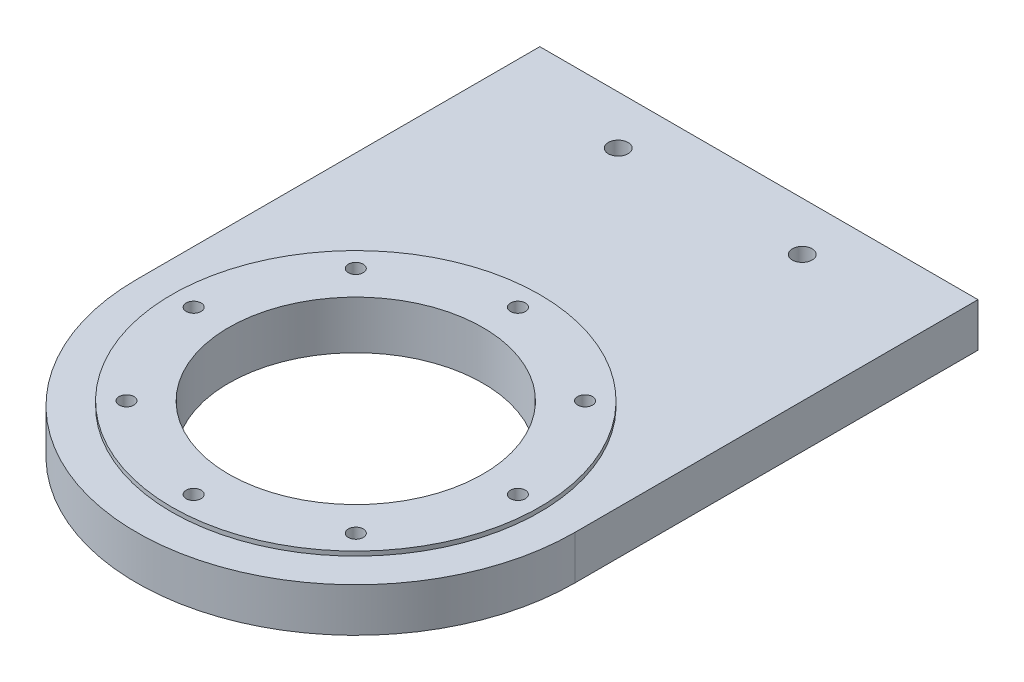
ISO-10303-21;
HEADER;
FILE_DESCRIPTION(('STEP AP214'),'2;1');
FILE_NAME('part.step','',(''),(''),'','','');
FILE_SCHEMA(('AUTOMOTIVE_DESIGN { 1 0 10303 214 1 1 1 1 }'));
ENDSEC;
DATA;
#1=APPLICATION_CONTEXT('core data for automotive mechanical design processes');
#2=APPLICATION_PROTOCOL_DEFINITION('international standard','automotive_design',2000,#1);
#3=PRODUCT_CONTEXT('',#1,'mechanical');
#4=PRODUCT('Part','Part','',(#3));
#5=PRODUCT_RELATED_PRODUCT_CATEGORY('part','',(#4));
#6=PRODUCT_DEFINITION_FORMATION('','',#4);
#7=PRODUCT_DEFINITION_CONTEXT('part definition',#1,'design');
#8=PRODUCT_DEFINITION('design','',#6,#7);
#9=PRODUCT_DEFINITION_SHAPE('','',#8);
#10=(LENGTH_UNIT() NAMED_UNIT(*) SI_UNIT(.MILLI.,.METRE.));
#11=(NAMED_UNIT(*) PLANE_ANGLE_UNIT() SI_UNIT($,.RADIAN.));
#12=(NAMED_UNIT(*) SI_UNIT($,.STERADIAN.) SOLID_ANGLE_UNIT());
#13=UNCERTAINTY_MEASURE_WITH_UNIT(LENGTH_MEASURE(1.E-05),#10,'distance_accuracy_value','');
#14=(GEOMETRIC_REPRESENTATION_CONTEXT(3) GLOBAL_UNCERTAINTY_ASSIGNED_CONTEXT((#13)) GLOBAL_UNIT_ASSIGNED_CONTEXT((#10,
#11,#12)) REPRESENTATION_CONTEXT('',''));
#15=CARTESIAN_POINT('',(0.,0.,0.));
#16=DIRECTION('',(0.,0.,1.));
#17=DIRECTION('',(1.,0.,0.));
#18=AXIS2_PLACEMENT_3D('',#15,#16,#17);
#19=CARTESIAN_POINT('',(50.,-29.75,170.));
#20=DIRECTION('',(-1.,0.,0.));
#21=DIRECTION('',(0.,0.,1.));
#22=AXIS2_PLACEMENT_3D('',#19,#20,#21);
#23=PLANE('',#22);
#24=DIRECTION('',(0.,0.,-1.));
#25=VECTOR('',#24,1.);
#26=CARTESIAN_POINT('',(50.,-39.75,170.));
#27=LINE('',#26,#25);
#28=CARTESIAN_POINT('',(50.,-39.75,170.));
#29=VERTEX_POINT('',#28);
#30=CARTESIAN_POINT('',(50.,-39.75,78.));
#31=VERTEX_POINT('',#30);
#32=EDGE_CURVE('E112',#29,#31,#27,.T.);
#33=ORIENTED_EDGE('',*,*,#32,.T.);
#34=DIRECTION('',(0.,-1.,0.));
#35=VECTOR('',#34,1.);
#36=CARTESIAN_POINT('',(50.,-29.75,78.));
#37=LINE('',#36,#35);
#38=CARTESIAN_POINT('',(50.,-29.75,78.));
#39=VERTEX_POINT('',#38);
#40=EDGE_CURVE('E46',#39,#31,#37,.T.);
#41=ORIENTED_EDGE('',*,*,#40,.F.);
#42=DIRECTION('',(0.,0.,-1.));
#43=VECTOR('',#42,1.);
#44=CARTESIAN_POINT('',(50.,-29.75,170.));
#45=LINE('',#44,#43);
#46=CARTESIAN_POINT('',(50.,-29.75,170.));
#47=VERTEX_POINT('',#46);
#48=EDGE_CURVE('E62',#47,#39,#45,.T.);
#49=ORIENTED_EDGE('',*,*,#48,.F.);
#50=DIRECTION('',(0.,-1.,0.));
#51=VECTOR('',#50,1.);
#52=CARTESIAN_POINT('',(50.,-29.75,170.));
#53=LINE('',#52,#51);
#54=EDGE_CURVE('E78',#47,#29,#53,.T.);
#55=ORIENTED_EDGE('',*,*,#54,.T.);
#56=EDGE_LOOP('',(#33,#41,#49,#55));
#57=FACE_BOUND('',#56,.T.);
#58=ADVANCED_FACE('F43',(#57),#23,.F.);
#59=CARTESIAN_POINT('',(-50.,-29.75,78.));
#60=DIRECTION('',(0.,0.,1.));
#61=DIRECTION('',(1.,0.,0.));
#62=AXIS2_PLACEMENT_3D('',#59,#60,#61);
#63=PLANE('',#62);
#64=DIRECTION('',(-1.,0.,0.));
#65=VECTOR('',#64,1.);
#66=CARTESIAN_POINT('',(-50.,-39.75,78.));
#67=LINE('',#66,#65);
#68=CARTESIAN_POINT('',(-50.,-39.75,78.));
#69=VERTEX_POINT('',#68);
#70=EDGE_CURVE('E77',#31,#69,#67,.T.);
#71=ORIENTED_EDGE('',*,*,#70,.T.);
#72=DIRECTION('',(0.,-1.,0.));
#73=VECTOR('',#72,1.);
#74=CARTESIAN_POINT('',(-50.,-29.75,78.));
#75=LINE('',#74,#73);
#76=CARTESIAN_POINT('',(-50.,-29.75,78.));
#77=VERTEX_POINT('',#76);
#78=EDGE_CURVE('E100',#77,#69,#75,.T.);
#79=ORIENTED_EDGE('',*,*,#78,.F.);
#80=DIRECTION('',(-1.,0.,0.));
#81=VECTOR('',#80,1.);
#82=CARTESIAN_POINT('',(-50.,-29.75,78.));
#83=LINE('',#82,#81);
#84=EDGE_CURVE('E84',#39,#77,#83,.T.);
#85=ORIENTED_EDGE('',*,*,#84,.F.);
#86=ORIENTED_EDGE('',*,*,#40,.T.);
#87=EDGE_LOOP('',(#71,#79,#85,#86));
#88=FACE_BOUND('',#87,.T.);
#89=ADVANCED_FACE('F139',(#88),#63,.F.);
#90=CARTESIAN_POINT('',(-50.,-29.75,170.));
#91=DIRECTION('',(1.,0.,0.));
#92=DIRECTION('',(0.,0.,-1.));
#93=AXIS2_PLACEMENT_3D('',#90,#91,#92);
#94=PLANE('',#93);
#95=DIRECTION('',(0.,0.,1.));
#96=VECTOR('',#95,1.);
#97=CARTESIAN_POINT('',(-50.,-39.75,170.));
#98=LINE('',#97,#96);
#99=CARTESIAN_POINT('',(-50.,-39.75,170.));
#100=VERTEX_POINT('',#99);
#101=EDGE_CURVE('E93',#69,#100,#98,.T.);
#102=ORIENTED_EDGE('',*,*,#101,.T.);
#103=DIRECTION('',(0.,-1.,0.));
#104=VECTOR('',#103,1.);
#105=CARTESIAN_POINT('',(-50.,-29.75,170.));
#106=LINE('',#105,#104);
#107=CARTESIAN_POINT('',(-50.,-29.75,170.));
#108=VERTEX_POINT('',#107);
#109=EDGE_CURVE('E92',#108,#100,#106,.T.);
#110=ORIENTED_EDGE('',*,*,#109,.F.);
#111=DIRECTION('',(0.,0.,1.));
#112=VECTOR('',#111,1.);
#113=CARTESIAN_POINT('',(-50.,-29.75,170.));
#114=LINE('',#113,#112);
#115=EDGE_CURVE('E127',#77,#108,#114,.T.);
#116=ORIENTED_EDGE('',*,*,#115,.F.);
#117=ORIENTED_EDGE('',*,*,#78,.T.);
#118=EDGE_LOOP('',(#102,#110,#116,#117));
#119=FACE_BOUND('',#118,.T.);
#120=ADVANCED_FACE('F91',(#119),#94,.F.);
#121=CARTESIAN_POINT('',(0.,-29.75,0.));
#122=DIRECTION('',(0.,-1.,0.));
#123=DIRECTION('',(0.,0.,-1.));
#124=AXIS2_PLACEMENT_3D('',#121,#122,#123);
#125=PLANE('',#124);
#126=CARTESIAN_POINT('',(-21.,-29.75,89.11));
#127=DIRECTION('',(0.,1.,0.));
#128=DIRECTION('',(0.,0.,1.));
#129=AXIS2_PLACEMENT_3D('',#126,#127,#128);
#130=CIRCLE('',#129,2.25);
#131=CARTESIAN_POINT('',(-21.,-29.75,91.36));
#132=VERTEX_POINT('',#131);
#133=EDGE_CURVE('E215',#132,#132,#130,.T.);
#134=ORIENTED_EDGE('',*,*,#133,.F.);
#135=EDGE_LOOP('',(#134));
#136=FACE_BOUND('',#135,.T.);
#137=CARTESIAN_POINT('',(21.,-29.75,89.11));
#138=DIRECTION('',(0.,1.,0.));
#139=DIRECTION('',(0.,0.,1.));
#140=AXIS2_PLACEMENT_3D('',#137,#138,#139);
#141=CIRCLE('',#140,2.25);
#142=CARTESIAN_POINT('',(21.,-29.75,91.36));
#143=VERTEX_POINT('',#142);
#144=EDGE_CURVE('E223',#143,#143,#141,.T.);
#145=ORIENTED_EDGE('',*,*,#144,.F.);
#146=EDGE_LOOP('',(#145));
#147=FACE_BOUND('',#146,.T.);
#148=CARTESIAN_POINT('',(0.,-29.75,170.));
#149=DIRECTION('',(0.,1.,0.));
#150=DIRECTION('',(0.,0.,1.));
#151=AXIS2_PLACEMENT_3D('',#148,#149,#150);
#152=CIRCLE('',#151,42.);
#153=CARTESIAN_POINT('',(0.,-29.75,212.));
#154=VERTEX_POINT('',#153);
#155=EDGE_CURVE('E11',#154,#154,#152,.T.);
#156=ORIENTED_EDGE('',*,*,#155,.F.);
#157=EDGE_LOOP('',(#156));
#158=FACE_BOUND('',#157,.T.);
#159=ORIENTED_EDGE('',*,*,#115,.T.);
#160=CARTESIAN_POINT('',(0.,-29.75,170.));
#161=DIRECTION('',(0.,1.,0.));
#162=DIRECTION('',(0.,0.,1.));
#163=AXIS2_PLACEMENT_3D('',#160,#161,#162);
#164=CIRCLE('',#163,50.);
#165=EDGE_CURVE('E110',#108,#47,#164,.T.);
#166=ORIENTED_EDGE('',*,*,#165,.T.);
#167=ORIENTED_EDGE('',*,*,#48,.T.);
#168=ORIENTED_EDGE('',*,*,#84,.T.);
#169=EDGE_LOOP('',(#159,#166,#167,#168));
#170=FACE_BOUND('',#169,.T.);
#171=ADVANCED_FACE('F148',(#136,#147,#158,#170),#125,.F.);
#172=CARTESIAN_POINT('',(0.,-39.75,0.));
#173=DIRECTION('',(0.,-1.,0.));
#174=DIRECTION('',(0.,0.,-1.));
#175=AXIS2_PLACEMENT_3D('',#172,#173,#174);
#176=PLANE('',#175);
#177=CARTESIAN_POINT('',(-21.,-39.75,89.11));
#178=DIRECTION('',(0.,1.,0.));
#179=DIRECTION('',(0.,0.,1.));
#180=AXIS2_PLACEMENT_3D('',#177,#178,#179);
#181=CIRCLE('',#180,2.25);
#182=CARTESIAN_POINT('',(-21.,-39.75,91.36));
#183=VERTEX_POINT('',#182);
#184=EDGE_CURVE('E214',#183,#183,#181,.T.);
#185=ORIENTED_EDGE('',*,*,#184,.T.);
#186=EDGE_LOOP('',(#185));
#187=FACE_BOUND('',#186,.T.);
#188=CARTESIAN_POINT('',(21.,-39.75,89.11));
#189=DIRECTION('',(0.,1.,0.));
#190=DIRECTION('',(0.,0.,1.));
#191=AXIS2_PLACEMENT_3D('',#188,#189,#190);
#192=CIRCLE('',#191,2.25);
#193=CARTESIAN_POINT('',(21.,-39.75,91.36));
#194=VERTEX_POINT('',#193);
#195=EDGE_CURVE('E220',#194,#194,#192,.T.);
#196=ORIENTED_EDGE('',*,*,#195,.T.);
#197=EDGE_LOOP('',(#196));
#198=FACE_BOUND('',#197,.T.);
#199=CARTESIAN_POINT('',(37.,-39.75,170.));
#200=DIRECTION('',(0.,1.,0.));
#201=DIRECTION('',(0.,0.,1.));
#202=AXIS2_PLACEMENT_3D('',#199,#200,#201);
#203=CIRCLE('',#202,1.7);
#204=CARTESIAN_POINT('',(37.,-39.75,171.7));
#205=VERTEX_POINT('',#204);
#206=EDGE_CURVE('E237',#205,#205,#203,.T.);
#207=ORIENTED_EDGE('',*,*,#206,.T.);
#208=EDGE_LOOP('',(#207));
#209=FACE_BOUND('',#208,.T.);
#210=CARTESIAN_POINT('',(26.1629509039023,-39.75,196.162950903902));
#211=DIRECTION('',(0.,1.,0.));
#212=DIRECTION('',(0.,0.,1.));
#213=AXIS2_PLACEMENT_3D('',#210,#211,#212);
#214=CIRCLE('',#213,1.7);
#215=CARTESIAN_POINT('',(26.1629509039023,-39.75,197.862950903902));
#216=VERTEX_POINT('',#215);
#217=EDGE_CURVE('E238',#216,#216,#214,.T.);
#218=ORIENTED_EDGE('',*,*,#217,.T.);
#219=EDGE_LOOP('',(#218));
#220=FACE_BOUND('',#219,.T.);
#221=CARTESIAN_POINT('',(0.,-39.75,207.));
#222=DIRECTION('',(0.,1.,0.));
#223=DIRECTION('',(0.,0.,1.));
#224=AXIS2_PLACEMENT_3D('',#221,#222,#223);
#225=CIRCLE('',#224,1.7);
#226=CARTESIAN_POINT('',(0.,-39.75,208.7));
#227=VERTEX_POINT('',#226);
#228=EDGE_CURVE('E246',#227,#227,#225,.T.);
#229=ORIENTED_EDGE('',*,*,#228,.T.);
#230=EDGE_LOOP('',(#229));
#231=FACE_BOUND('',#230,.T.);
#232=CARTESIAN_POINT('',(-26.1629509039023,-39.75,196.162950903902));
#233=DIRECTION('',(0.,1.,0.));
#234=DIRECTION('',(0.,0.,1.));
#235=AXIS2_PLACEMENT_3D('',#232,#233,#234);
#236=CIRCLE('',#235,1.7);
#237=CARTESIAN_POINT('',(-26.1629509039023,-39.75,197.862950903902));
#238=VERTEX_POINT('',#237);
#239=EDGE_CURVE('E254',#238,#238,#236,.T.);
#240=ORIENTED_EDGE('',*,*,#239,.T.);
#241=EDGE_LOOP('',(#240));
#242=FACE_BOUND('',#241,.T.);
#243=CARTESIAN_POINT('',(-37.,-39.75,170.));
#244=DIRECTION('',(0.,1.,0.));
#245=DIRECTION('',(0.,0.,1.));
#246=AXIS2_PLACEMENT_3D('',#243,#244,#245);
#247=CIRCLE('',#246,1.7);
#248=CARTESIAN_POINT('',(-37.,-39.75,171.7));
#249=VERTEX_POINT('',#248);
#250=EDGE_CURVE('E265',#249,#249,#247,.T.);
#251=ORIENTED_EDGE('',*,*,#250,.T.);
#252=EDGE_LOOP('',(#251));
#253=FACE_BOUND('',#252,.T.);
#254=CARTESIAN_POINT('',(-26.1629509039023,-39.75,143.837049096098));
#255=DIRECTION('',(0.,1.,0.));
#256=DIRECTION('',(0.,0.,1.));
#257=AXIS2_PLACEMENT_3D('',#254,#255,#256);
#258=CIRCLE('',#257,1.7);
#259=CARTESIAN_POINT('',(-26.1629509039023,-39.75,145.537049096098));
#260=VERTEX_POINT('',#259);
#261=EDGE_CURVE('E268',#260,#260,#258,.T.);
#262=ORIENTED_EDGE('',*,*,#261,.T.);
#263=EDGE_LOOP('',(#262));
#264=FACE_BOUND('',#263,.T.);
#265=CARTESIAN_POINT('',(0.,-39.75,133.));
#266=DIRECTION('',(0.,1.,0.));
#267=DIRECTION('',(0.,0.,1.));
#268=AXIS2_PLACEMENT_3D('',#265,#266,#267);
#269=CIRCLE('',#268,1.7);
#270=CARTESIAN_POINT('',(0.,-39.75,134.7));
#271=VERTEX_POINT('',#270);
#272=EDGE_CURVE('E277',#271,#271,#269,.T.);
#273=ORIENTED_EDGE('',*,*,#272,.T.);
#274=EDGE_LOOP('',(#273));
#275=FACE_BOUND('',#274,.T.);
#276=CARTESIAN_POINT('',(26.1629509039023,-39.75,143.837049096098));
#277=DIRECTION('',(0.,1.,0.));
#278=DIRECTION('',(0.,0.,1.));
#279=AXIS2_PLACEMENT_3D('',#276,#277,#278);
#280=CIRCLE('',#279,1.7);
#281=CARTESIAN_POINT('',(26.1629509039023,-39.75,145.537049096098));
#282=VERTEX_POINT('',#281);
#283=EDGE_CURVE('E285',#282,#282,#280,.T.);
#284=ORIENTED_EDGE('',*,*,#283,.T.);
#285=EDGE_LOOP('',(#284));
#286=FACE_BOUND('',#285,.T.);
#287=CARTESIAN_POINT('',(0.,-39.75,170.));
#288=DIRECTION('',(0.,1.,0.));
#289=DIRECTION('',(0.,0.,1.));
#290=AXIS2_PLACEMENT_3D('',#287,#288,#289);
#291=CIRCLE('',#290,29.);
#292=CARTESIAN_POINT('',(0.,-39.75,199.));
#293=VERTEX_POINT('',#292);
#294=EDGE_CURVE('E234',#293,#293,#291,.T.);
#295=ORIENTED_EDGE('',*,*,#294,.T.);
#296=EDGE_LOOP('',(#295));
#297=FACE_BOUND('',#296,.T.);
#298=ORIENTED_EDGE('',*,*,#32,.F.);
#299=CARTESIAN_POINT('',(0.,-39.75,170.));
#300=DIRECTION('',(0.,1.,0.));
#301=DIRECTION('',(0.,0.,1.));
#302=AXIS2_PLACEMENT_3D('',#299,#300,#301);
#303=CIRCLE('',#302,50.);
#304=EDGE_CURVE('E104',#100,#29,#303,.T.);
#305=ORIENTED_EDGE('',*,*,#304,.F.);
#306=ORIENTED_EDGE('',*,*,#101,.F.);
#307=ORIENTED_EDGE('',*,*,#70,.F.);
#308=EDGE_LOOP('',(#298,#305,#306,#307));
#309=FACE_BOUND('',#308,.T.);
#310=ADVANCED_FACE('F109',(#187,#198,#209,#220,#231,#242,#253,#264,#275,#286,#297,#309),#176,.T.);
#311=CARTESIAN_POINT('',(0.,-29.75,170.));
#312=DIRECTION('',(0.,-1.,0.));
#313=DIRECTION('',(0.,0.,-1.));
#314=AXIS2_PLACEMENT_3D('',#311,#312,#313);
#315=CYLINDRICAL_SURFACE('',#314,50.);
#316=ORIENTED_EDGE('',*,*,#304,.T.);
#317=ORIENTED_EDGE('',*,*,#54,.F.);
#318=ORIENTED_EDGE('',*,*,#165,.F.);
#319=ORIENTED_EDGE('',*,*,#109,.T.);
#320=EDGE_LOOP('',(#316,#317,#318,#319));
#321=FACE_BOUND('',#320,.T.);
#322=ADVANCED_FACE('F102',(#321),#315,.T.);
#323=CARTESIAN_POINT('',(0.,-28.75,170.));
#324=DIRECTION('',(0.,1.,0.));
#325=DIRECTION('',(0.,0.,1.));
#326=AXIS2_PLACEMENT_3D('',#323,#324,#325);
#327=PLANE('',#326);
#328=CARTESIAN_POINT('',(37.,-28.75,170.));
#329=DIRECTION('',(0.,1.,0.));
#330=DIRECTION('',(0.,0.,1.));
#331=AXIS2_PLACEMENT_3D('',#328,#329,#330);
#332=CIRCLE('',#331,1.7);
#333=CARTESIAN_POINT('',(37.,-28.75,171.7));
#334=VERTEX_POINT('',#333);
#335=EDGE_CURVE('E233',#334,#334,#332,.T.);
#336=ORIENTED_EDGE('',*,*,#335,.F.);
#337=EDGE_LOOP('',(#336));
#338=FACE_BOUND('',#337,.T.);
#339=CARTESIAN_POINT('',(26.1629509039023,-28.75,196.162950903902));
#340=DIRECTION('',(0.,1.,0.));
#341=DIRECTION('',(0.,0.,1.));
#342=AXIS2_PLACEMENT_3D('',#339,#340,#341);
#343=CIRCLE('',#342,1.7);
#344=CARTESIAN_POINT('',(26.1629509039023,-28.75,197.862950903902));
#345=VERTEX_POINT('',#344);
#346=EDGE_CURVE('E241',#345,#345,#343,.T.);
#347=ORIENTED_EDGE('',*,*,#346,.F.);
#348=EDGE_LOOP('',(#347));
#349=FACE_BOUND('',#348,.T.);
#350=CARTESIAN_POINT('',(0.,-28.75,207.));
#351=DIRECTION('',(0.,1.,0.));
#352=DIRECTION('',(0.,0.,1.));
#353=AXIS2_PLACEMENT_3D('',#350,#351,#352);
#354=CIRCLE('',#353,1.7);
#355=CARTESIAN_POINT('',(0.,-28.75,208.7));
#356=VERTEX_POINT('',#355);
#357=EDGE_CURVE('E253',#356,#356,#354,.T.);
#358=ORIENTED_EDGE('',*,*,#357,.F.);
#359=EDGE_LOOP('',(#358));
#360=FACE_BOUND('',#359,.T.);
#361=CARTESIAN_POINT('',(-26.1629509039023,-28.75,196.162950903902));
#362=DIRECTION('',(0.,1.,0.));
#363=DIRECTION('',(0.,0.,1.));
#364=AXIS2_PLACEMENT_3D('',#361,#362,#363);
#365=CIRCLE('',#364,1.7);
#366=CARTESIAN_POINT('',(-26.1629509039023,-28.75,197.862950903902));
#367=VERTEX_POINT('',#366);
#368=EDGE_CURVE('E256',#367,#367,#365,.T.);
#369=ORIENTED_EDGE('',*,*,#368,.F.);
#370=EDGE_LOOP('',(#369));
#371=FACE_BOUND('',#370,.T.);
#372=CARTESIAN_POINT('',(-37.,-28.75,170.));
#373=DIRECTION('',(0.,1.,0.));
#374=DIRECTION('',(0.,0.,1.));
#375=AXIS2_PLACEMENT_3D('',#372,#373,#374);
#376=CIRCLE('',#375,1.7);
#377=CARTESIAN_POINT('',(-37.,-28.75,171.7));
#378=VERTEX_POINT('',#377);
#379=EDGE_CURVE('E264',#378,#378,#376,.T.);
#380=ORIENTED_EDGE('',*,*,#379,.F.);
#381=EDGE_LOOP('',(#380));
#382=FACE_BOUND('',#381,.T.);
#383=CARTESIAN_POINT('',(-26.1629509039023,-28.75,143.837049096098));
#384=DIRECTION('',(0.,1.,0.));
#385=DIRECTION('',(0.,0.,1.));
#386=AXIS2_PLACEMENT_3D('',#383,#384,#385);
#387=CIRCLE('',#386,1.7);
#388=CARTESIAN_POINT('',(-26.1629509039023,-28.75,145.537049096098));
#389=VERTEX_POINT('',#388);
#390=EDGE_CURVE('E275',#389,#389,#387,.T.);
#391=ORIENTED_EDGE('',*,*,#390,.F.);
#392=EDGE_LOOP('',(#391));
#393=FACE_BOUND('',#392,.T.);
#394=CARTESIAN_POINT('',(0.,-28.75,133.));
#395=DIRECTION('',(0.,1.,0.));
#396=DIRECTION('',(0.,0.,1.));
#397=AXIS2_PLACEMENT_3D('',#394,#395,#396);
#398=CIRCLE('',#397,1.7);
#399=CARTESIAN_POINT('',(0.,-28.75,134.7));
#400=VERTEX_POINT('',#399);
#401=EDGE_CURVE('E278',#400,#400,#398,.T.);
#402=ORIENTED_EDGE('',*,*,#401,.F.);
#403=EDGE_LOOP('',(#402));
#404=FACE_BOUND('',#403,.T.);
#405=CARTESIAN_POINT('',(26.1629509039023,-28.75,143.837049096098));
#406=DIRECTION('',(0.,1.,0.));
#407=DIRECTION('',(0.,0.,1.));
#408=AXIS2_PLACEMENT_3D('',#405,#406,#407);
#409=CIRCLE('',#408,1.7);
#410=CARTESIAN_POINT('',(26.1629509039023,-28.75,145.537049096098));
#411=VERTEX_POINT('',#410);
#412=EDGE_CURVE('E222',#411,#411,#409,.T.);
#413=ORIENTED_EDGE('',*,*,#412,.F.);
#414=EDGE_LOOP('',(#413));
#415=FACE_BOUND('',#414,.T.);
#416=CARTESIAN_POINT('',(0.,-28.75,170.));
#417=DIRECTION('',(0.,1.,0.));
#418=DIRECTION('',(0.,0.,1.));
#419=AXIS2_PLACEMENT_3D('',#416,#417,#418);
#420=CIRCLE('',#419,42.);
#421=CARTESIAN_POINT('',(0.,-28.75,212.));
#422=VERTEX_POINT('',#421);
#423=EDGE_CURVE('E114',#422,#422,#420,.T.);
#424=ORIENTED_EDGE('',*,*,#423,.T.);
#425=EDGE_LOOP('',(#424));
#426=FACE_BOUND('',#425,.T.);
#427=CARTESIAN_POINT('',(0.,-28.75,170.));
#428=DIRECTION('',(0.,1.,0.));
#429=DIRECTION('',(0.,0.,1.));
#430=AXIS2_PLACEMENT_3D('',#427,#428,#429);
#431=CIRCLE('',#430,29.);
#432=CARTESIAN_POINT('',(0.,-28.75,199.));
#433=VERTEX_POINT('',#432);
#434=EDGE_CURVE('E116',#433,#433,#431,.T.);
#435=ORIENTED_EDGE('',*,*,#434,.F.);
#436=EDGE_LOOP('',(#435));
#437=FACE_BOUND('',#436,.T.);
#438=ADVANCED_FACE('F160',(#338,#349,#360,#371,#382,#393,#404,#415,#426,#437),#327,.T.);
#439=CARTESIAN_POINT('',(0.,-28.75,170.));
#440=DIRECTION('',(0.,-1.,0.));
#441=DIRECTION('',(0.,0.,-1.));
#442=AXIS2_PLACEMENT_3D('',#439,#440,#441);
#443=CYLINDRICAL_SURFACE('',#442,42.);
#444=ORIENTED_EDGE('',*,*,#423,.F.);
#445=EDGE_LOOP('',(#444));
#446=FACE_BOUND('',#445,.T.);
#447=ORIENTED_EDGE('',*,*,#155,.T.);
#448=EDGE_LOOP('',(#447));
#449=FACE_BOUND('',#448,.T.);
#450=ADVANCED_FACE('F158',(#446,#449),#443,.T.);
#451=CARTESIAN_POINT('',(0.,-28.75,170.));
#452=DIRECTION('',(0.,-1.,0.));
#453=DIRECTION('',(0.,0.,-1.));
#454=AXIS2_PLACEMENT_3D('',#451,#452,#453);
#455=CYLINDRICAL_SURFACE('',#454,29.);
#456=ORIENTED_EDGE('',*,*,#434,.T.);
#457=EDGE_LOOP('',(#456));
#458=FACE_BOUND('',#457,.T.);
#459=ORIENTED_EDGE('',*,*,#294,.F.);
#460=EDGE_LOOP('',(#459));
#461=FACE_BOUND('',#460,.T.);
#462=ADVANCED_FACE('F161',(#458,#461),#455,.F.);
#463=CARTESIAN_POINT('',(26.1629509039023,-28.75,143.837049096098));
#464=DIRECTION('',(0.,-1.,0.));
#465=DIRECTION('',(0.,0.,-1.));
#466=AXIS2_PLACEMENT_3D('',#463,#464,#465);
#467=CYLINDRICAL_SURFACE('',#466,1.7);
#468=ORIENTED_EDGE('',*,*,#412,.T.);
#469=EDGE_LOOP('',(#468));
#470=FACE_BOUND('',#469,.T.);
#471=ORIENTED_EDGE('',*,*,#283,.F.);
#472=EDGE_LOOP('',(#471));
#473=FACE_BOUND('',#472,.T.);
#474=ADVANCED_FACE('F169',(#470,#473),#467,.F.);
#475=CARTESIAN_POINT('',(0.,-28.75,133.));
#476=DIRECTION('',(0.,-1.,0.));
#477=DIRECTION('',(0.,0.,-1.));
#478=AXIS2_PLACEMENT_3D('',#475,#476,#477);
#479=CYLINDRICAL_SURFACE('',#478,1.7);
#480=ORIENTED_EDGE('',*,*,#401,.T.);
#481=EDGE_LOOP('',(#480));
#482=FACE_BOUND('',#481,.T.);
#483=ORIENTED_EDGE('',*,*,#272,.F.);
#484=EDGE_LOOP('',(#483));
#485=FACE_BOUND('',#484,.T.);
#486=ADVANCED_FACE('F174',(#482,#485),#479,.F.);
#487=CARTESIAN_POINT('',(-26.1629509039023,-28.75,143.837049096098));
#488=DIRECTION('',(0.,-1.,0.));
#489=DIRECTION('',(0.,0.,-1.));
#490=AXIS2_PLACEMENT_3D('',#487,#488,#489);
#491=CYLINDRICAL_SURFACE('',#490,1.7);
#492=ORIENTED_EDGE('',*,*,#390,.T.);
#493=EDGE_LOOP('',(#492));
#494=FACE_BOUND('',#493,.T.);
#495=ORIENTED_EDGE('',*,*,#261,.F.);
#496=EDGE_LOOP('',(#495));
#497=FACE_BOUND('',#496,.T.);
#498=ADVANCED_FACE('F178',(#494,#497),#491,.F.);
#499=CARTESIAN_POINT('',(-37.,-28.75,170.));
#500=DIRECTION('',(0.,-1.,0.));
#501=DIRECTION('',(0.,0.,-1.));
#502=AXIS2_PLACEMENT_3D('',#499,#500,#501);
#503=CYLINDRICAL_SURFACE('',#502,1.7);
#504=ORIENTED_EDGE('',*,*,#379,.T.);
#505=EDGE_LOOP('',(#504));
#506=FACE_BOUND('',#505,.T.);
#507=ORIENTED_EDGE('',*,*,#250,.F.);
#508=EDGE_LOOP('',(#507));
#509=FACE_BOUND('',#508,.T.);
#510=ADVANCED_FACE('F179',(#506,#509),#503,.F.);
#511=CARTESIAN_POINT('',(-26.1629509039023,-28.75,196.162950903902));
#512=DIRECTION('',(0.,-1.,0.));
#513=DIRECTION('',(0.,0.,-1.));
#514=AXIS2_PLACEMENT_3D('',#511,#512,#513);
#515=CYLINDRICAL_SURFACE('',#514,1.7);
#516=ORIENTED_EDGE('',*,*,#368,.T.);
#517=EDGE_LOOP('',(#516));
#518=FACE_BOUND('',#517,.T.);
#519=ORIENTED_EDGE('',*,*,#239,.F.);
#520=EDGE_LOOP('',(#519));
#521=FACE_BOUND('',#520,.T.);
#522=ADVANCED_FACE('F184',(#518,#521),#515,.F.);
#523=CARTESIAN_POINT('',(0.,-28.75,207.));
#524=DIRECTION('',(0.,-1.,0.));
#525=DIRECTION('',(0.,0.,-1.));
#526=AXIS2_PLACEMENT_3D('',#523,#524,#525);
#527=CYLINDRICAL_SURFACE('',#526,1.7);
#528=ORIENTED_EDGE('',*,*,#357,.T.);
#529=EDGE_LOOP('',(#528));
#530=FACE_BOUND('',#529,.T.);
#531=ORIENTED_EDGE('',*,*,#228,.F.);
#532=EDGE_LOOP('',(#531));
#533=FACE_BOUND('',#532,.T.);
#534=ADVANCED_FACE('F190',(#530,#533),#527,.F.);
#535=CARTESIAN_POINT('',(26.1629509039023,-28.75,196.162950903902));
#536=DIRECTION('',(0.,-1.,0.));
#537=DIRECTION('',(0.,0.,-1.));
#538=AXIS2_PLACEMENT_3D('',#535,#536,#537);
#539=CYLINDRICAL_SURFACE('',#538,1.7);
#540=ORIENTED_EDGE('',*,*,#346,.T.);
#541=EDGE_LOOP('',(#540));
#542=FACE_BOUND('',#541,.T.);
#543=ORIENTED_EDGE('',*,*,#217,.F.);
#544=EDGE_LOOP('',(#543));
#545=FACE_BOUND('',#544,.T.);
#546=ADVANCED_FACE('F195',(#542,#545),#539,.F.);
#547=CARTESIAN_POINT('',(37.,-28.75,170.));
#548=DIRECTION('',(0.,-1.,0.));
#549=DIRECTION('',(0.,0.,-1.));
#550=AXIS2_PLACEMENT_3D('',#547,#548,#549);
#551=CYLINDRICAL_SURFACE('',#550,1.7);
#552=ORIENTED_EDGE('',*,*,#335,.T.);
#553=EDGE_LOOP('',(#552));
#554=FACE_BOUND('',#553,.T.);
#555=ORIENTED_EDGE('',*,*,#206,.F.);
#556=EDGE_LOOP('',(#555));
#557=FACE_BOUND('',#556,.T.);
#558=ADVANCED_FACE('F198',(#554,#557),#551,.F.);
#559=CARTESIAN_POINT('',(21.,-29.75,89.11));
#560=DIRECTION('',(0.,-1.,0.));
#561=DIRECTION('',(0.,0.,-1.));
#562=AXIS2_PLACEMENT_3D('',#559,#560,#561);
#563=CYLINDRICAL_SURFACE('',#562,2.25);
#564=ORIENTED_EDGE('',*,*,#144,.T.);
#565=EDGE_LOOP('',(#564));
#566=FACE_BOUND('',#565,.T.);
#567=ORIENTED_EDGE('',*,*,#195,.F.);
#568=EDGE_LOOP('',(#567));
#569=FACE_BOUND('',#568,.T.);
#570=ADVANCED_FACE('F199',(#566,#569),#563,.F.);
#571=CARTESIAN_POINT('',(-21.,-29.75,89.11));
#572=DIRECTION('',(0.,-1.,0.));
#573=DIRECTION('',(0.,0.,-1.));
#574=AXIS2_PLACEMENT_3D('',#571,#572,#573);
#575=CYLINDRICAL_SURFACE('',#574,2.25);
#576=ORIENTED_EDGE('',*,*,#133,.T.);
#577=EDGE_LOOP('',(#576));
#578=FACE_BOUND('',#577,.T.);
#579=ORIENTED_EDGE('',*,*,#184,.F.);
#580=EDGE_LOOP('',(#579));
#581=FACE_BOUND('',#580,.T.);
#582=ADVANCED_FACE('F204',(#578,#581),#575,.F.);
#583=CLOSED_SHELL('',(#58,#89,#120,#171,#310,#322,#438,#450,#462,#474,#486,#498,#510,#522,#534,
#546,#558,#570,#582));
#584=MANIFOLD_SOLID_BREP('B2',#583);
#585=ADVANCED_BREP_SHAPE_REPRESENTATION('',(#18,#584),#14);
#586=SHAPE_DEFINITION_REPRESENTATION(#9,#585);
ENDSEC;
END-ISO-10303-21;
